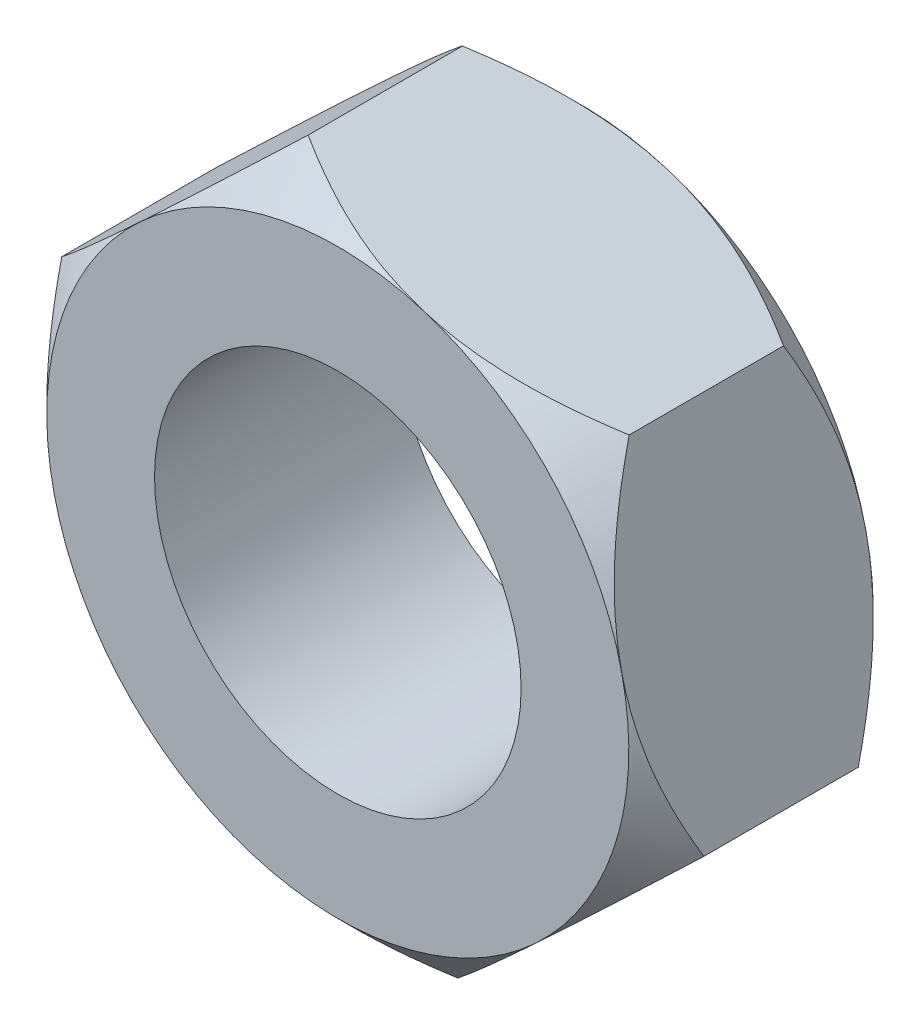
ISO-10303-21;
HEADER;
FILE_DESCRIPTION(('STEP AP214'),'2;1');
FILE_NAME('part.step','',(''),(''),'','','');
FILE_SCHEMA(('AUTOMOTIVE_DESIGN { 1 0 10303 214 1 1 1 1 }'));
ENDSEC;
DATA;
#1=APPLICATION_CONTEXT('core data for automotive mechanical design processes');
#2=APPLICATION_PROTOCOL_DEFINITION('international standard','automotive_design',2000,#1);
#3=PRODUCT_CONTEXT('',#1,'mechanical');
#4=PRODUCT('Part','Part','',(#3));
#5=PRODUCT_RELATED_PRODUCT_CATEGORY('part','',(#4));
#6=PRODUCT_DEFINITION_FORMATION('','',#4);
#7=PRODUCT_DEFINITION_CONTEXT('part definition',#1,'design');
#8=PRODUCT_DEFINITION('design','',#6,#7);
#9=PRODUCT_DEFINITION_SHAPE('','',#8);
#10=(LENGTH_UNIT() NAMED_UNIT(*) SI_UNIT(.MILLI.,.METRE.));
#11=(NAMED_UNIT(*) PLANE_ANGLE_UNIT() SI_UNIT($,.RADIAN.));
#12=(NAMED_UNIT(*) SI_UNIT($,.STERADIAN.) SOLID_ANGLE_UNIT());
#13=UNCERTAINTY_MEASURE_WITH_UNIT(LENGTH_MEASURE(1.E-05),#10,'distance_accuracy_value','');
#14=(GEOMETRIC_REPRESENTATION_CONTEXT(3) GLOBAL_UNCERTAINTY_ASSIGNED_CONTEXT((#13)) GLOBAL_UNIT_ASSIGNED_CONTEXT((#10,
#11,#12)) REPRESENTATION_CONTEXT('',''));
#15=CARTESIAN_POINT('',(0.,0.,0.));
#16=DIRECTION('',(0.,0.,1.));
#17=DIRECTION('',(1.,0.,0.));
#18=AXIS2_PLACEMENT_3D('',#15,#16,#17);
#19=CARTESIAN_POINT('',(0.,0.,-1.));
#20=DIRECTION('',(0.,0.,1.));
#21=DIRECTION('',(1.,0.,0.));
#22=AXIS2_PLACEMENT_3D('',#19,#20,#21);
#23=PLANE('',#22);
#24=CARTESIAN_POINT('',(0.,0.,-1.));
#25=DIRECTION('',(0.,0.,1.));
#26=DIRECTION('',(1.,0.,0.));
#27=AXIS2_PLACEMENT_3D('',#24,#25,#26);
#28=CIRCLE('',#27,1.5);
#29=CARTESIAN_POINT('',(1.5,0.,-1.));
#30=VERTEX_POINT('',#29);
#31=EDGE_CURVE('E291',#30,#30,#28,.F.);
#32=ORIENTED_EDGE('',*,*,#31,.F.);
#33=EDGE_LOOP('',(#32));
#34=FACE_BOUND('',#33,.T.);
#35=CARTESIAN_POINT('',(0.,0.,-1.));
#36=DIRECTION('',(0.,0.,1.));
#37=DIRECTION('',(1.,0.,0.));
#38=AXIS2_PLACEMENT_3D('',#35,#36,#37);
#39=CIRCLE('',#38,2.38156986040721);
#40=CARTESIAN_POINT('',(2.32195813988488,0.52951430256639,-1.));
#41=VERTEX_POINT('',#40);
#42=CARTESIAN_POINT('',(1.61955190763213,-1.74611758438117,-1.));
#43=VERTEX_POINT('',#42);
#44=EDGE_CURVE('E73',#41,#43,#39,.F.);
#45=ORIENTED_EDGE('',*,*,#44,.T.);
#46=CARTESIAN_POINT('',(-0.702406232252746,-2.27563188694756,-1.));
#47=VERTEX_POINT('',#46);
#48=EDGE_CURVE('E13',#43,#47,#39,.F.);
#49=ORIENTED_EDGE('',*,*,#48,.T.);
#50=CARTESIAN_POINT('',(-2.32195813988488,-0.529514302566389,-1.));
#51=VERTEX_POINT('',#50);
#52=EDGE_CURVE('E78',#47,#51,#39,.F.);
#53=ORIENTED_EDGE('',*,*,#52,.T.);
#54=CARTESIAN_POINT('',(-1.61955190763213,1.74611758438117,-1.));
#55=VERTEX_POINT('',#54);
#56=EDGE_CURVE('E400',#51,#55,#39,.F.);
#57=ORIENTED_EDGE('',*,*,#56,.T.);
#58=CARTESIAN_POINT('',(0.702406232252745,2.27563188694756,-1.));
#59=VERTEX_POINT('',#58);
#60=EDGE_CURVE('E176',#55,#59,#39,.F.);
#61=ORIENTED_EDGE('',*,*,#60,.T.);
#62=CARTESIAN_POINT('',(0.,0.,-1.));
#63=DIRECTION('',(0.,0.,1.));
#64=DIRECTION('',(1.,0.,0.));
#65=AXIS2_PLACEMENT_3D('',#62,#63,#64);
#66=CIRCLE('',#65,2.38156986040721);
#67=EDGE_CURVE('E160',#41,#59,#66,.T.);
#68=ORIENTED_EDGE('',*,*,#67,.F.);
#69=EDGE_LOOP('',(#45,#49,#53,#57,#61,#68));
#70=FACE_BOUND('',#69,.T.);
#71=ADVANCED_FACE('F68',(#34,#70),#23,.F.);
#72=CARTESIAN_POINT('',(0.611430450252922,-2.68116631421915,1.));
#73=DIRECTION('',(-0.680035439882169,0.733179241730332,0.));
#74=DIRECTION('',(-0.733179241730332,-0.680035439882169,0.));
#75=AXIS2_PLACEMENT_3D('',#72,#73,#74);
#76=PLANE('',#75);
#77=DIRECTION('',(0.,0.,-1.));
#78=VECTOR('',#77,1.);
#79=CARTESIAN_POINT('',(0.611430450252922,-2.68116631421915,1.));
#80=LINE('',#79,#78);
#81=CARTESIAN_POINT('',(0.611430450252922,-2.68116631421915,0.631569860407208));
#82=VERTEX_POINT('',#81);
#83=CARTESIAN_POINT('',(0.611430450252922,-2.68116631421915,-0.631569860407208));
#84=VERTEX_POINT('',#83);
#85=EDGE_CURVE('E294',#82,#84,#80,.T.);
#86=ORIENTED_EDGE('',*,*,#85,.T.);
#87=CARTESIAN_POINT('',(0.611230450252922,-2.68135181740887,-0.631433457964915));
#88=CARTESIAN_POINT('',(0.680541761179161,-2.6170644711069,-0.678662709142081));
#89=CARTESIAN_POINT('',(0.751012080580562,-2.55170212595966,-0.723118290181747));
#90=CARTESIAN_POINT('',(0.894709000677139,-2.4184209408064,-0.804515707316653));
#91=CARTESIAN_POINT('',(0.967949270087409,-2.35048942284913,-0.841412248853858));
#92=CARTESIAN_POINT('',(1.11563481105216,-2.21350872822774,-0.904616915766419));
#93=CARTESIAN_POINT('',(1.19004246354937,-2.14449444383922,-0.931083918963827));
#94=CARTESIAN_POINT('',(1.34049598707439,-2.00494640124775,-0.971861988156976));
#95=CARTESIAN_POINT('',(1.41653726079552,-1.93441690712008,-0.986203498002277));
#96=CARTESIAN_POINT('',(1.54758795064178,-1.81286530221357,-0.999143140687914));
#97=CARTESIAN_POINT('',(1.60242802258368,-1.76200026086548,-1.00105881335752));
#98=CARTESIAN_POINT('',(1.71201854858218,-1.66035330018718,-0.997832805821307));
#99=CARTESIAN_POINT('',(1.76676896448226,-1.60957141624776,-0.992688651318966));
#100=CARTESIAN_POINT('',(1.8757528517185,-1.50848712269649,-0.97563572227116));
#101=CARTESIAN_POINT('',(1.92998567554035,-1.4581853136645,-0.963719379308982));
#102=CARTESIAN_POINT('',(2.03751351578149,-1.35845152692308,-0.933776198588584));
#103=CARTESIAN_POINT('',(2.09080860375736,-1.30901948284379,-0.915749829218989));
#104=CARTESIAN_POINT('',(2.2273277948899,-1.18239575577936,-0.862231476107135));
#105=CARTESIAN_POINT('',(2.30970521421385,-1.10598938555247,-0.822704331781714));
#106=CARTESIAN_POINT('',(2.43083377411541,-0.993640714413669,-0.755976643536789));
#107=CARTESIAN_POINT('',(2.47075101384226,-0.956616837943207,-0.732531533268135));
#108=CARTESIAN_POINT('',(2.54984601887044,-0.883254959325529,-0.683504038689965));
#109=CARTESIAN_POINT('',(2.58902422045442,-0.846916552519204,-0.657922967018528));
#110=CARTESIAN_POINT('',(2.62787336501134,-0.810883351353467,-0.631433457964914));
#111=B_SPLINE_CURVE_WITH_KNOTS('',3,(#87,#88,#89,#90,#91,#92,#93,#94,#95,#96,#97,#98,#99,#100,
#101,#102,#103,#104,#105,#106,#107,#108,#109,#110),.UNSPECIFIED.,.F.,.F.,(4,2,2,2,2,2,2,2,2,2,2,
4),(0.,0.317249126947665,0.636346964277055,0.950376235600918,1.26361470262345,1.48776348709125,
1.71199085028319,1.93646929815348,2.16093054161688,2.51750160715865,2.69530374505947,
2.87299740912661),.UNSPECIFIED.);
#112=EDGE_CURVE('E87',#84,#43,#111,.T.);
#113=ORIENTED_EDGE('',*,*,#112,.T.);
#114=CARTESIAN_POINT('',(2.62767336501134,-0.811068854543185,-0.631569860407208));
#115=VERTEX_POINT('',#114);
#116=EDGE_CURVE('E174',#43,#115,#111,.T.);
#117=ORIENTED_EDGE('',*,*,#116,.T.);
#118=DIRECTION('',(0.,0.,-1.));
#119=VECTOR('',#118,1.);
#120=CARTESIAN_POINT('',(2.62767336501134,-0.811068854543186,1.));
#121=LINE('',#120,#119);
#122=CARTESIAN_POINT('',(2.62767336501134,-0.811068854543185,0.631569860407208));
#123=VERTEX_POINT('',#122);
#124=EDGE_CURVE('E186',#123,#115,#121,.T.);
#125=ORIENTED_EDGE('',*,*,#124,.F.);
#126=CARTESIAN_POINT('',(0.611230450252922,-2.68135181740887,0.631433457964915));
#127=CARTESIAN_POINT('',(0.680541761179161,-2.6170644711069,0.678662709142081));
#128=CARTESIAN_POINT('',(0.751012080580562,-2.55170212595966,0.723118290181747));
#129=CARTESIAN_POINT('',(0.894709000677139,-2.4184209408064,0.804515707316653));
#130=CARTESIAN_POINT('',(0.967949270087409,-2.35048942284913,0.841412248853858));
#131=CARTESIAN_POINT('',(1.11563481105216,-2.21350872822774,0.904616915766419));
#132=CARTESIAN_POINT('',(1.19004246354937,-2.14449444383922,0.931083918963827));
#133=CARTESIAN_POINT('',(1.34049598707439,-2.00494640124775,0.971861988156976));
#134=CARTESIAN_POINT('',(1.41653726079552,-1.93441690712008,0.986203498002277));
#135=CARTESIAN_POINT('',(1.54758795064178,-1.81286530221357,0.999143140687914));
#136=CARTESIAN_POINT('',(1.60242802258368,-1.76200026086548,1.00105881335752));
#137=CARTESIAN_POINT('',(1.71201854858218,-1.66035330018718,0.997832805821307));
#138=CARTESIAN_POINT('',(1.76676896448226,-1.60957141624776,0.992688651318966));
#139=CARTESIAN_POINT('',(1.8757528517185,-1.50848712269649,0.97563572227116));
#140=CARTESIAN_POINT('',(1.92998567554035,-1.4581853136645,0.963719379308982));
#141=CARTESIAN_POINT('',(2.03751351578149,-1.35845152692308,0.933776198588584));
#142=CARTESIAN_POINT('',(2.09080860375736,-1.30901948284379,0.915749829218989));
#143=CARTESIAN_POINT('',(2.2273277948899,-1.18239575577936,0.862231476107135));
#144=CARTESIAN_POINT('',(2.30970521421385,-1.10598938555247,0.822704331781714));
#145=CARTESIAN_POINT('',(2.43083377411541,-0.993640714413669,0.755976643536789));
#146=CARTESIAN_POINT('',(2.47075101384226,-0.956616837943207,0.732531533268135));
#147=CARTESIAN_POINT('',(2.54984601887044,-0.883254959325529,0.683504038689965));
#148=CARTESIAN_POINT('',(2.58902422045442,-0.846916552519204,0.657922967018528));
#149=CARTESIAN_POINT('',(2.62787336501134,-0.810883351353467,0.631433457964914));
#150=B_SPLINE_CURVE_WITH_KNOTS('',3,(#126,#127,#128,#129,#130,#131,#132,#133,#134,#135,#136,
#137,#138,#139,#140,#141,#142,#143,#144,#145,#146,#147,#148,#149),.UNSPECIFIED.,.F.,.F.,(4,2,2,
2,2,2,2,2,2,2,2,4),(0.,0.317249126947665,0.636346964277055,0.950376235600918,1.26361470262345,
1.48776348709125,1.71199085028319,1.93646929815348,2.16093054161688,2.51750160715865,
2.69530374505947,2.87299740912661),.UNSPECIFIED.);
#151=CARTESIAN_POINT('',(1.61955190763213,-1.74611758438117,1.));
#152=VERTEX_POINT('',#151);
#153=EDGE_CURVE('E281',#152,#123,#150,.T.);
#154=ORIENTED_EDGE('',*,*,#153,.F.);
#155=EDGE_CURVE('E287',#82,#152,#150,.T.);
#156=ORIENTED_EDGE('',*,*,#155,.F.);
#157=EDGE_LOOP('',(#86,#113,#117,#125,#154,#156));
#158=FACE_BOUND('',#157,.T.);
#159=ADVANCED_FACE('F70',(#158),#76,.F.);
#160=CARTESIAN_POINT('',(2.62767336501134,-0.811068854543186,1.));
#161=DIRECTION('',(-0.974969568806964,-0.222338345546518,0.));
#162=DIRECTION('',(0.222338345546518,-0.974969568806964,0.));
#163=AXIS2_PLACEMENT_3D('',#160,#161,#162);
#164=PLANE('',#163);
#165=ORIENTED_EDGE('',*,*,#124,.T.);
#166=CARTESIAN_POINT('',(2.62771897430062,-0.811268854543186,-0.63146728736537));
#167=CARTESIAN_POINT('',(2.60670106162273,-0.719103802174839,-0.678692772648547));
#168=CARTESIAN_POINT('',(2.58533170120751,-0.625397626308076,-0.723144649952084));
#169=CARTESIAN_POINT('',(2.54175722112842,-0.434320410413189,-0.804535001472545));
#170=CARTESIAN_POINT('',(2.51954795737711,-0.336931198264897,-0.841428189989373));
#171=CARTESIAN_POINT('',(2.47476403670943,-0.140550498770503,-0.904626953775373));
#172=CARTESIAN_POINT('',(2.45220078520717,-0.0416090249821052,-0.931091377602507));
#173=CARTESIAN_POINT('',(2.40657755587188,0.158452103129972,-0.971865321713531));
#174=CARTESIAN_POINT('',(2.38351897178063,0.259565645796133,-0.986205278804895));
#175=CARTESIAN_POINT('',(2.34377870848557,0.43382954649138,-0.99914363010685));
#176=CARTESIAN_POINT('',(2.32714836996095,0.506754771965221,-1.00105892206034));
#177=CARTESIAN_POINT('',(2.29391487789397,0.652486014818751,-0.997832196257242));
#178=CARTESIAN_POINT('',(2.27731173592465,0.725291981449826,-0.992687704375998));
#179=CARTESIAN_POINT('',(2.24426222512478,0.870216453270591,-0.975634164767153));
#180=CARTESIAN_POINT('',(2.22781605262658,0.942334097528842,-0.963717549994477));
#181=CARTESIAN_POINT('',(2.19520810198074,1.08532229645022,-0.933773896962632));
#182=CARTESIAN_POINT('',(2.17904630213053,1.15619294628065,-0.91574732714528));
#183=CARTESIAN_POINT('',(2.13764965777203,1.33772019656694,-0.862232375649407));
#184=CARTESIAN_POINT('',(2.11267147344941,1.44725132372695,-0.822710445312067));
#185=CARTESIAN_POINT('',(2.07594322494769,1.6083073238368,-0.755992147989942));
#186=CARTESIAN_POINT('',(2.06383962416678,1.66138248010536,-0.732550429100542));
#187=CARTESIAN_POINT('',(2.03985661651566,1.76654968628756,-0.683530122726857));
#188=CARTESIAN_POINT('',(2.02797707744075,1.81864231592831,-0.657952846939881));
#189=CARTESIAN_POINT('',(2.01619730546913,1.87029745967596,-0.63146728736537));
#190=B_SPLINE_CURVE_WITH_KNOTS('',3,(#166,#167,#168,#169,#170,#171,#172,#173,#174,#175,#176,
#177,#178,#179,#180,#181,#182,#183,#184,#185,#186,#187,#188,#189),.UNSPECIFIED.,.F.,.F.,(4,2,2,
2,2,2,2,2,2,2,2,4),(0.,0.31723309539091,0.636314541517665,0.950328270182844,1.26355135006615,
1.48769951877146,1.7119262610095,1.93640404408789,2.16086462065607,2.51739304394166,
2.6951738520973,2.87284625625676),.UNSPECIFIED.);
#191=EDGE_CURVE('E168',#115,#41,#190,.T.);
#192=ORIENTED_EDGE('',*,*,#191,.T.);
#193=CARTESIAN_POINT('',(2.01624291475841,1.87009745967596,-0.631569860407208));
#194=VERTEX_POINT('',#193);
#195=EDGE_CURVE('E156',#41,#194,#190,.T.);
#196=ORIENTED_EDGE('',*,*,#195,.T.);
#197=DIRECTION('',(0.,0.,-1.));
#198=VECTOR('',#197,1.);
#199=CARTESIAN_POINT('',(2.01624291475841,1.87009745967596,1.));
#200=LINE('',#199,#198);
#201=CARTESIAN_POINT('',(2.01624291475841,1.87009745967596,0.631569860407208));
#202=VERTEX_POINT('',#201);
#203=EDGE_CURVE('E306',#202,#194,#200,.T.);
#204=ORIENTED_EDGE('',*,*,#203,.F.);
#205=CARTESIAN_POINT('',(2.62771897430062,-0.811268854543186,0.63146728736537));
#206=CARTESIAN_POINT('',(2.60670106162273,-0.719103802174839,0.678692772648547));
#207=CARTESIAN_POINT('',(2.58533170120751,-0.625397626308076,0.723144649952084));
#208=CARTESIAN_POINT('',(2.54175722112842,-0.434320410413189,0.804535001472545));
#209=CARTESIAN_POINT('',(2.51954795737711,-0.336931198264897,0.841428189989373));
#210=CARTESIAN_POINT('',(2.47476403670943,-0.140550498770503,0.904626953775373));
#211=CARTESIAN_POINT('',(2.45220078520717,-0.0416090249821052,0.931091377602507));
#212=CARTESIAN_POINT('',(2.40657755587188,0.158452103129972,0.971865321713531));
#213=CARTESIAN_POINT('',(2.38351897178063,0.259565645796133,0.986205278804895));
#214=CARTESIAN_POINT('',(2.34377870848557,0.43382954649138,0.99914363010685));
#215=CARTESIAN_POINT('',(2.32714836996095,0.506754771965221,1.00105892206034));
#216=CARTESIAN_POINT('',(2.29391487789397,0.652486014818751,0.997832196257242));
#217=CARTESIAN_POINT('',(2.27731173592465,0.725291981449826,0.992687704375998));
#218=CARTESIAN_POINT('',(2.24426222512478,0.870216453270591,0.975634164767153));
#219=CARTESIAN_POINT('',(2.22781605262658,0.942334097528842,0.963717549994477));
#220=CARTESIAN_POINT('',(2.19520810198074,1.08532229645022,0.933773896962632));
#221=CARTESIAN_POINT('',(2.17904630213053,1.15619294628065,0.91574732714528));
#222=CARTESIAN_POINT('',(2.13764965777203,1.33772019656694,0.862232375649407));
#223=CARTESIAN_POINT('',(2.11267147344941,1.44725132372695,0.822710445312067));
#224=CARTESIAN_POINT('',(2.07594322494769,1.6083073238368,0.755992147989942));
#225=CARTESIAN_POINT('',(2.06383962416678,1.66138248010536,0.732550429100542));
#226=CARTESIAN_POINT('',(2.03985661651566,1.76654968628756,0.683530122726857));
#227=CARTESIAN_POINT('',(2.02797707744075,1.81864231592831,0.657952846939881));
#228=CARTESIAN_POINT('',(2.01619730546913,1.87029745967596,0.63146728736537));
#229=B_SPLINE_CURVE_WITH_KNOTS('',3,(#205,#206,#207,#208,#209,#210,#211,#212,#213,#214,#215,
#216,#217,#218,#219,#220,#221,#222,#223,#224,#225,#226,#227,#228),.UNSPECIFIED.,.F.,.F.,(4,2,2,
2,2,2,2,2,2,2,2,4),(0.,0.31723309539091,0.636314541517665,0.950328270182844,1.26355135006615,
1.48769951877146,1.7119262610095,1.93640404408789,2.16086462065607,2.51739304394166,
2.6951738520973,2.87284625625676),.UNSPECIFIED.);
#230=CARTESIAN_POINT('',(2.32195813988488,0.52951430256639,1.));
#231=VERTEX_POINT('',#230);
#232=EDGE_CURVE('E274',#231,#202,#229,.T.);
#233=ORIENTED_EDGE('',*,*,#232,.F.);
#234=EDGE_CURVE('E280',#123,#231,#229,.T.);
#235=ORIENTED_EDGE('',*,*,#234,.F.);
#236=EDGE_LOOP('',(#165,#192,#196,#204,#233,#235));
#237=FACE_BOUND('',#236,.T.);
#238=ADVANCED_FACE('F183',(#237),#164,.F.);
#239=CARTESIAN_POINT('',(2.01624291475841,1.87009745967596,1.));
#240=DIRECTION('',(-0.294934128924795,-0.95551758727685,0.));
#241=DIRECTION('',(0.95551758727685,-0.294934128924795,0.));
#242=AXIS2_PLACEMENT_3D('',#239,#240,#241);
#243=PLANE('',#242);
#244=ORIENTED_EDGE('',*,*,#203,.T.);
#245=CARTESIAN_POINT('',(2.01644291475841,1.87003572682398,-0.631465199112025));
#246=CARTESIAN_POINT('',(1.92611644114631,1.89791628095334,-0.678690916856313));
#247=CARTESIAN_POINT('',(1.83427958511017,1.92626303615584,-0.723143022784127));
#248=CARTESIAN_POINT('',(1.64701410418061,1.98406519723698,-0.804533810451347));
#249=CARTESIAN_POINT('',(1.55156766946506,2.0135261003712,-0.84142720594391));
#250=CARTESIAN_POINT('',(1.35910448537038,2.07293260665313,-0.904626334120865));
#251=CARTESIAN_POINT('',(1.26213675241389,2.10286308018302,-0.931090917169493));
#252=CARTESIAN_POINT('',(1.06606654579734,2.16338294540221,-0.97186511591994));
#253=CARTESIAN_POINT('',(0.966970061965575,2.19397048824559,-0.98620516886389));
#254=CARTESIAN_POINT('',(0.796182655111617,2.24668645678715,-0.999143599890724));
#255=CARTESIAN_POINT('',(0.72471237648162,2.26874677744731,-1.00105891535028));
#256=CARTESIAN_POINT('',(0.581888646789228,2.31283135827294,-0.997832233895231));
#257=CARTESIAN_POINT('',(0.510535245462415,2.33485560308681,-0.992687762845372));
#258=CARTESIAN_POINT('',(0.368502186202382,2.37869613220859,-0.975634260936656));
#259=CARTESIAN_POINT('',(0.297823372031236,2.4005121560773,-0.963717662948052));
#260=CARTESIAN_POINT('',(0.15768795159562,2.44376695191573,-0.933774039082376));
#261=CARTESIAN_POINT('',(0.0882312520633301,2.46520575267389,-0.915747481643836));
#262=CARTESIAN_POINT('',(-0.0896751092486592,2.5201190880247,-0.862232320167742));
#263=CARTESIAN_POINT('',(-0.197021726287377,2.55325315212871,-0.822710067969581));
#264=CARTESIAN_POINT('',(-0.354865572177383,2.6019739060045,-0.755991190942998));
#265=CARTESIAN_POINT('',(-0.406882176810341,2.61802957277749,-0.732549262702771));
#266=CARTESIAN_POINT('',(-0.509951879859642,2.64984350639018,-0.683528512598582));
#267=CARTESIAN_POINT('',(-0.561005546463019,2.66560194860891,-0.657951002489993));
#268=CARTESIAN_POINT('',(-0.611630450252923,2.68122804707114,-0.631465199112024));
#269=B_SPLINE_CURVE_WITH_KNOTS('',3,(#245,#246,#247,#248,#249,#250,#251,#252,#253,#254,#255,
#256,#257,#258,#259,#260,#261,#262,#263,#264,#265,#266,#267,#268),.UNSPECIFIED.,.F.,.F.,(4,2,2,
2,2,2,2,2,2,2,2,4),(0.,0.317234084978965,0.63631654289263,0.950331230969133,1.26355526066448,
1.48770346737092,1.71193024793047,1.93640807203655,2.16086868976234,2.51739974543782,
2.69518187031937,2.87285558689427),.UNSPECIFIED.);
#270=EDGE_CURVE('E163',#194,#59,#269,.T.);
#271=ORIENTED_EDGE('',*,*,#270,.T.);
#272=CARTESIAN_POINT('',(-0.611430450252923,2.68116631421915,-0.631569860407208));
#273=VERTEX_POINT('',#272);
#274=EDGE_CURVE('E194',#59,#273,#269,.T.);
#275=ORIENTED_EDGE('',*,*,#274,.T.);
#276=DIRECTION('',(0.,0.,-1.));
#277=VECTOR('',#276,1.);
#278=CARTESIAN_POINT('',(-0.611430450252923,2.68116631421915,1.));
#279=LINE('',#278,#277);
#280=CARTESIAN_POINT('',(-0.611430450252923,2.68116631421915,0.631569860407208));
#281=VERTEX_POINT('',#280);
#282=EDGE_CURVE('E303',#281,#273,#279,.T.);
#283=ORIENTED_EDGE('',*,*,#282,.F.);
#284=CARTESIAN_POINT('',(2.01644291475841,1.87003572682398,0.631465199112025));
#285=CARTESIAN_POINT('',(1.92611644114631,1.89791628095334,0.678690916856313));
#286=CARTESIAN_POINT('',(1.83427958511017,1.92626303615584,0.723143022784127));
#287=CARTESIAN_POINT('',(1.64701410418061,1.98406519723698,0.804533810451347));
#288=CARTESIAN_POINT('',(1.55156766946506,2.0135261003712,0.84142720594391));
#289=CARTESIAN_POINT('',(1.35910448537038,2.07293260665313,0.904626334120865));
#290=CARTESIAN_POINT('',(1.26213675241389,2.10286308018302,0.931090917169493));
#291=CARTESIAN_POINT('',(1.06606654579734,2.16338294540221,0.97186511591994));
#292=CARTESIAN_POINT('',(0.966970061965575,2.19397048824559,0.98620516886389));
#293=CARTESIAN_POINT('',(0.796182655111617,2.24668645678715,0.999143599890724));
#294=CARTESIAN_POINT('',(0.72471237648162,2.26874677744731,1.00105891535028));
#295=CARTESIAN_POINT('',(0.581888646789228,2.31283135827294,0.997832233895231));
#296=CARTESIAN_POINT('',(0.510535245462415,2.33485560308681,0.992687762845372));
#297=CARTESIAN_POINT('',(0.368502186202382,2.37869613220859,0.975634260936656));
#298=CARTESIAN_POINT('',(0.297823372031236,2.4005121560773,0.963717662948052));
#299=CARTESIAN_POINT('',(0.15768795159562,2.44376695191573,0.933774039082376));
#300=CARTESIAN_POINT('',(0.0882312520633301,2.46520575267389,0.915747481643836));
#301=CARTESIAN_POINT('',(-0.0896751092486592,2.5201190880247,0.862232320167742));
#302=CARTESIAN_POINT('',(-0.197021726287377,2.55325315212871,0.822710067969581));
#303=CARTESIAN_POINT('',(-0.354865572177383,2.6019739060045,0.755991190942998));
#304=CARTESIAN_POINT('',(-0.406882176810341,2.61802957277749,0.732549262702771));
#305=CARTESIAN_POINT('',(-0.509951879859642,2.64984350639018,0.683528512598582));
#306=CARTESIAN_POINT('',(-0.561005546463019,2.66560194860891,0.657951002489993));
#307=CARTESIAN_POINT('',(-0.611630450252923,2.68122804707114,0.631465199112024));
#308=B_SPLINE_CURVE_WITH_KNOTS('',3,(#284,#285,#286,#287,#288,#289,#290,#291,#292,#293,#294,
#295,#296,#297,#298,#299,#300,#301,#302,#303,#304,#305,#306,#307),.UNSPECIFIED.,.F.,.F.,(4,2,2,
2,2,2,2,2,2,2,2,4),(0.,0.317234084978965,0.63631654289263,0.950331230969133,1.26355526066448,
1.48770346737092,1.71193024793047,1.93640807203655,2.16086868976234,2.51739974543782,
2.69518187031937,2.87285558689427),.UNSPECIFIED.);
#309=CARTESIAN_POINT('',(0.702406232252745,2.27563188694756,1.));
#310=VERTEX_POINT('',#309);
#311=EDGE_CURVE('E267',#310,#281,#308,.T.);
#312=ORIENTED_EDGE('',*,*,#311,.F.);
#313=EDGE_CURVE('E273',#202,#310,#308,.T.);
#314=ORIENTED_EDGE('',*,*,#313,.F.);
#315=EDGE_LOOP('',(#244,#271,#275,#283,#312,#314));
#316=FACE_BOUND('',#315,.T.);
#317=ADVANCED_FACE('F246',(#316),#243,.F.);
#318=CARTESIAN_POINT('',(-0.611430450252923,2.68116631421915,1.));
#319=DIRECTION('',(0.680035439882169,-0.733179241730332,0.));
#320=DIRECTION('',(0.733179241730332,0.680035439882169,0.));
#321=AXIS2_PLACEMENT_3D('',#318,#319,#320);
#322=PLANE('',#321);
#323=ORIENTED_EDGE('',*,*,#282,.T.);
#324=CARTESIAN_POINT('',(-0.611230450252923,2.68135181740887,-0.631433457964914));
#325=CARTESIAN_POINT('',(-0.680541761179161,2.6170644711069,-0.678662709142081));
#326=CARTESIAN_POINT('',(-0.751012080580562,2.55170212595966,-0.723118290181747));
#327=CARTESIAN_POINT('',(-0.89470900067714,2.4184209408064,-0.804515707316653));
#328=CARTESIAN_POINT('',(-0.967949270087409,2.35048942284913,-0.841412248853858));
#329=CARTESIAN_POINT('',(-1.11563481105216,2.21350872822774,-0.904616915766419));
#330=CARTESIAN_POINT('',(-1.19004246354937,2.14449444383922,-0.931083918963826));
#331=CARTESIAN_POINT('',(-1.3404959870744,2.00494640124775,-0.971861988156975));
#332=CARTESIAN_POINT('',(-1.41653726079553,1.93441690712008,-0.986203498002276));
#333=CARTESIAN_POINT('',(-1.54758795064178,1.81286530221357,-0.999143140687913));
#334=CARTESIAN_POINT('',(-1.60242802258368,1.76200026086548,-1.00105881335752));
#335=CARTESIAN_POINT('',(-1.71201854858218,1.66035330018718,-0.997832805821307));
#336=CARTESIAN_POINT('',(-1.76676896448226,1.60957141624776,-0.992688651318966));
#337=CARTESIAN_POINT('',(-1.8757528517185,1.50848712269649,-0.97563572227116));
#338=CARTESIAN_POINT('',(-1.92998567554035,1.4581853136645,-0.963719379308982));
#339=CARTESIAN_POINT('',(-2.03751351578149,1.35845152692308,-0.933776198588584));
#340=CARTESIAN_POINT('',(-2.09080860375736,1.30901948284379,-0.915749829218989));
#341=CARTESIAN_POINT('',(-2.2273277948899,1.18239575577936,-0.862231476107135));
#342=CARTESIAN_POINT('',(-2.30970521421385,1.10598938555247,-0.822704331781714));
#343=CARTESIAN_POINT('',(-2.43083377411541,0.99364071441367,-0.755976643536789));
#344=CARTESIAN_POINT('',(-2.47075101384226,0.956616837943208,-0.732531533268135));
#345=CARTESIAN_POINT('',(-2.54984601887044,0.88325495932553,-0.683504038689965));
#346=CARTESIAN_POINT('',(-2.58902422045442,0.846916552519206,-0.657922967018528));
#347=CARTESIAN_POINT('',(-2.62787336501134,0.810883351353468,-0.631433457964914));
#348=B_SPLINE_CURVE_WITH_KNOTS('',3,(#324,#325,#326,#327,#328,#329,#330,#331,#332,#333,#334,
#335,#336,#337,#338,#339,#340,#341,#342,#343,#344,#345,#346,#347),.UNSPECIFIED.,.F.,.F.,(4,2,2,
2,2,2,2,2,2,2,2,4),(0.,0.317249126947665,0.636346964277055,0.950376235600918,1.26361470262345,
1.48776348709125,1.71199085028319,1.93646929815348,2.16093054161688,2.51750160715865,
2.69530374505947,2.87299740912661),.UNSPECIFIED.);
#349=EDGE_CURVE('E240',#273,#55,#348,.T.);
#350=ORIENTED_EDGE('',*,*,#349,.T.);
#351=CARTESIAN_POINT('',(-2.62767336501134,0.811068854543187,-0.631569860407208));
#352=VERTEX_POINT('',#351);
#353=EDGE_CURVE('E233',#55,#352,#348,.T.);
#354=ORIENTED_EDGE('',*,*,#353,.T.);
#355=DIRECTION('',(0.,0.,-1.));
#356=VECTOR('',#355,1.);
#357=CARTESIAN_POINT('',(-2.62767336501134,0.811068854543187,1.));
#358=LINE('',#357,#356);
#359=CARTESIAN_POINT('',(-2.62767336501134,0.811068854543187,0.631569860407208));
#360=VERTEX_POINT('',#359);
#361=EDGE_CURVE('E300',#360,#352,#358,.T.);
#362=ORIENTED_EDGE('',*,*,#361,.F.);
#363=CARTESIAN_POINT('',(-0.611230450252923,2.68135181740887,0.631433457964914));
#364=CARTESIAN_POINT('',(-0.680541761179161,2.6170644711069,0.678662709142081));
#365=CARTESIAN_POINT('',(-0.751012080580562,2.55170212595966,0.723118290181747));
#366=CARTESIAN_POINT('',(-0.89470900067714,2.4184209408064,0.804515707316653));
#367=CARTESIAN_POINT('',(-0.967949270087409,2.35048942284913,0.841412248853858));
#368=CARTESIAN_POINT('',(-1.11563481105216,2.21350872822774,0.904616915766419));
#369=CARTESIAN_POINT('',(-1.19004246354937,2.14449444383922,0.931083918963826));
#370=CARTESIAN_POINT('',(-1.3404959870744,2.00494640124775,0.971861988156975));
#371=CARTESIAN_POINT('',(-1.41653726079553,1.93441690712008,0.986203498002276));
#372=CARTESIAN_POINT('',(-1.54758795064178,1.81286530221357,0.999143140687913));
#373=CARTESIAN_POINT('',(-1.60242802258368,1.76200026086548,1.00105881335752));
#374=CARTESIAN_POINT('',(-1.71201854858218,1.66035330018718,0.997832805821307));
#375=CARTESIAN_POINT('',(-1.76676896448226,1.60957141624776,0.992688651318966));
#376=CARTESIAN_POINT('',(-1.8757528517185,1.50848712269649,0.97563572227116));
#377=CARTESIAN_POINT('',(-1.92998567554035,1.4581853136645,0.963719379308982));
#378=CARTESIAN_POINT('',(-2.03751351578149,1.35845152692308,0.933776198588584));
#379=CARTESIAN_POINT('',(-2.09080860375736,1.30901948284379,0.915749829218989));
#380=CARTESIAN_POINT('',(-2.2273277948899,1.18239575577936,0.862231476107135));
#381=CARTESIAN_POINT('',(-2.30970521421385,1.10598938555247,0.822704331781714));
#382=CARTESIAN_POINT('',(-2.43083377411541,0.99364071441367,0.755976643536789));
#383=CARTESIAN_POINT('',(-2.47075101384226,0.956616837943208,0.732531533268135));
#384=CARTESIAN_POINT('',(-2.54984601887044,0.88325495932553,0.683504038689965));
#385=CARTESIAN_POINT('',(-2.58902422045442,0.846916552519206,0.657922967018528));
#386=CARTESIAN_POINT('',(-2.62787336501134,0.810883351353468,0.631433457964914));
#387=B_SPLINE_CURVE_WITH_KNOTS('',3,(#363,#364,#365,#366,#367,#368,#369,#370,#371,#372,#373,
#374,#375,#376,#377,#378,#379,#380,#381,#382,#383,#384,#385,#386),.UNSPECIFIED.,.F.,.F.,(4,2,2,
2,2,2,2,2,2,2,2,4),(0.,0.317249126947665,0.636346964277055,0.950376235600918,1.26361470262345,
1.48776348709125,1.71199085028319,1.93646929815348,2.16093054161688,2.51750160715865,
2.69530374505947,2.87299740912661),.UNSPECIFIED.);
#388=CARTESIAN_POINT('',(-1.61955190763213,1.74611758438117,1.));
#389=VERTEX_POINT('',#388);
#390=EDGE_CURVE('E252',#389,#360,#387,.T.);
#391=ORIENTED_EDGE('',*,*,#390,.F.);
#392=EDGE_CURVE('E259',#281,#389,#387,.T.);
#393=ORIENTED_EDGE('',*,*,#392,.F.);
#394=EDGE_LOOP('',(#323,#350,#354,#362,#391,#393));
#395=FACE_BOUND('',#394,.T.);
#396=ADVANCED_FACE('F242',(#395),#322,.F.);
#397=CARTESIAN_POINT('',(-2.62767336501134,0.811068854543187,1.));
#398=DIRECTION('',(0.974969568806964,0.222338345546517,0.));
#399=DIRECTION('',(-0.222338345546517,0.974969568806964,0.));
#400=AXIS2_PLACEMENT_3D('',#397,#398,#399);
#401=PLANE('',#400);
#402=ORIENTED_EDGE('',*,*,#361,.T.);
#403=CARTESIAN_POINT('',(-2.62771897430062,0.811268854543187,-0.63146728736537));
#404=CARTESIAN_POINT('',(-2.60670106162273,0.71910380217484,-0.678692772648547));
#405=CARTESIAN_POINT('',(-2.58533170120751,0.625397626308077,-0.723144649952084));
#406=CARTESIAN_POINT('',(-2.54175722112842,0.43432041041319,-0.804535001472545));
#407=CARTESIAN_POINT('',(-2.51954795737711,0.336931198264899,-0.841428189989372));
#408=CARTESIAN_POINT('',(-2.47476403670943,0.140550498770504,-0.904626953775373));
#409=CARTESIAN_POINT('',(-2.45220078520717,0.0416090249821068,-0.931091377602507));
#410=CARTESIAN_POINT('',(-2.40657755587188,-0.158452103129971,-0.97186532171353));
#411=CARTESIAN_POINT('',(-2.38351897178063,-0.259565645796132,-0.986205278804895));
#412=CARTESIAN_POINT('',(-2.34377870848557,-0.433829546491378,-0.99914363010685));
#413=CARTESIAN_POINT('',(-2.32714836996095,-0.50675477196522,-1.00105892206034));
#414=CARTESIAN_POINT('',(-2.29391487789397,-0.65248601481875,-0.997832196257242));
#415=CARTESIAN_POINT('',(-2.27731173592465,-0.725291981449825,-0.992687704375998));
#416=CARTESIAN_POINT('',(-2.24426222512478,-0.87021645327059,-0.975634164767153));
#417=CARTESIAN_POINT('',(-2.22781605262658,-0.942334097528841,-0.963717549994478));
#418=CARTESIAN_POINT('',(-2.19520810198074,-1.08532229645022,-0.933773896962632));
#419=CARTESIAN_POINT('',(-2.17904630213053,-1.15619294628065,-0.91574732714528));
#420=CARTESIAN_POINT('',(-2.13764965777203,-1.33772019656694,-0.862232375649406));
#421=CARTESIAN_POINT('',(-2.11267147344941,-1.44725132372695,-0.822710445312067));
#422=CARTESIAN_POINT('',(-2.07594322494769,-1.6083073238368,-0.755992147989942));
#423=CARTESIAN_POINT('',(-2.06383962416678,-1.66138248010536,-0.732550429100542));
#424=CARTESIAN_POINT('',(-2.03985661651567,-1.76654968628756,-0.683530122726856));
#425=CARTESIAN_POINT('',(-2.02797707744075,-1.81864231592831,-0.657952846939881));
#426=CARTESIAN_POINT('',(-2.01619730546913,-1.87029745967596,-0.63146728736537));
#427=B_SPLINE_CURVE_WITH_KNOTS('',3,(#403,#404,#405,#406,#407,#408,#409,#410,#411,#412,#413,
#414,#415,#416,#417,#418,#419,#420,#421,#422,#423,#424,#425,#426),.UNSPECIFIED.,.F.,.F.,(4,2,2,
2,2,2,2,2,2,2,2,4),(0.,0.31723309539091,0.636314541517665,0.950328270182843,1.26355135006615,
1.48769951877146,1.7119262610095,1.93640404408789,2.16086462065607,2.51739304394166,
2.6951738520973,2.87284625625676),.UNSPECIFIED.);
#428=EDGE_CURVE('E241',#352,#51,#427,.T.);
#429=ORIENTED_EDGE('',*,*,#428,.T.);
#430=CARTESIAN_POINT('',(-2.01624291475841,-1.87009745967596,-0.631569860407208));
#431=VERTEX_POINT('',#430);
#432=EDGE_CURVE('E226',#51,#431,#427,.T.);
#433=ORIENTED_EDGE('',*,*,#432,.T.);
#434=DIRECTION('',(0.,0.,-1.));
#435=VECTOR('',#434,1.);
#436=CARTESIAN_POINT('',(-2.01624291475841,-1.87009745967596,1.));
#437=LINE('',#436,#435);
#438=CARTESIAN_POINT('',(-2.01624291475841,-1.87009745967596,0.631569860407208));
#439=VERTEX_POINT('',#438);
#440=EDGE_CURVE('E297',#439,#431,#437,.T.);
#441=ORIENTED_EDGE('',*,*,#440,.F.);
#442=CARTESIAN_POINT('',(-2.62771897430062,0.811268854543187,0.63146728736537));
#443=CARTESIAN_POINT('',(-2.60670106162273,0.71910380217484,0.678692772648547));
#444=CARTESIAN_POINT('',(-2.58533170120751,0.625397626308077,0.723144649952084));
#445=CARTESIAN_POINT('',(-2.54175722112842,0.43432041041319,0.804535001472545));
#446=CARTESIAN_POINT('',(-2.51954795737711,0.336931198264899,0.841428189989372));
#447=CARTESIAN_POINT('',(-2.47476403670943,0.140550498770504,0.904626953775373));
#448=CARTESIAN_POINT('',(-2.45220078520717,0.0416090249821068,0.931091377602507));
#449=CARTESIAN_POINT('',(-2.40657755587188,-0.158452103129971,0.97186532171353));
#450=CARTESIAN_POINT('',(-2.38351897178063,-0.259565645796132,0.986205278804895));
#451=CARTESIAN_POINT('',(-2.34377870848557,-0.433829546491378,0.99914363010685));
#452=CARTESIAN_POINT('',(-2.32714836996095,-0.50675477196522,1.00105892206034));
#453=CARTESIAN_POINT('',(-2.29391487789397,-0.65248601481875,0.997832196257242));
#454=CARTESIAN_POINT('',(-2.27731173592465,-0.725291981449825,0.992687704375998));
#455=CARTESIAN_POINT('',(-2.24426222512478,-0.87021645327059,0.975634164767153));
#456=CARTESIAN_POINT('',(-2.22781605262658,-0.942334097528841,0.963717549994478));
#457=CARTESIAN_POINT('',(-2.19520810198074,-1.08532229645022,0.933773896962632));
#458=CARTESIAN_POINT('',(-2.17904630213053,-1.15619294628065,0.91574732714528));
#459=CARTESIAN_POINT('',(-2.13764965777203,-1.33772019656694,0.862232375649406));
#460=CARTESIAN_POINT('',(-2.11267147344941,-1.44725132372695,0.822710445312067));
#461=CARTESIAN_POINT('',(-2.07594322494769,-1.6083073238368,0.755992147989942));
#462=CARTESIAN_POINT('',(-2.06383962416678,-1.66138248010536,0.732550429100542));
#463=CARTESIAN_POINT('',(-2.03985661651567,-1.76654968628756,0.683530122726856));
#464=CARTESIAN_POINT('',(-2.02797707744075,-1.81864231592831,0.657952846939881));
#465=CARTESIAN_POINT('',(-2.01619730546913,-1.87029745967596,0.63146728736537));
#466=B_SPLINE_CURVE_WITH_KNOTS('',3,(#442,#443,#444,#445,#446,#447,#448,#449,#450,#451,#452,
#453,#454,#455,#456,#457,#458,#459,#460,#461,#462,#463,#464,#465),.UNSPECIFIED.,.F.,.F.,(4,2,2,
2,2,2,2,2,2,2,2,4),(0.,0.31723309539091,0.636314541517665,0.950328270182843,1.26355135006615,
1.48769951877146,1.7119262610095,1.93640404408789,2.16086462065607,2.51739304394166,
2.6951738520973,2.87284625625676),.UNSPECIFIED.);
#467=CARTESIAN_POINT('',(-2.32195813988488,-0.529514302566389,1.));
#468=VERTEX_POINT('',#467);
#469=EDGE_CURVE('E261',#468,#439,#466,.T.);
#470=ORIENTED_EDGE('',*,*,#469,.F.);
#471=EDGE_CURVE('E260',#360,#468,#466,.T.);
#472=ORIENTED_EDGE('',*,*,#471,.F.);
#473=EDGE_LOOP('',(#402,#429,#433,#441,#470,#472));
#474=FACE_BOUND('',#473,.T.);
#475=ADVANCED_FACE('F245',(#474),#401,.F.);
#476=CARTESIAN_POINT('',(-2.01624291475841,-1.87009745967596,1.));
#477=DIRECTION('',(0.294934128924795,0.95551758727685,0.));
#478=DIRECTION('',(-0.95551758727685,0.294934128924795,0.));
#479=AXIS2_PLACEMENT_3D('',#476,#477,#478);
#480=PLANE('',#479);
#481=ORIENTED_EDGE('',*,*,#440,.T.);
#482=CARTESIAN_POINT('',(-2.01644291475841,-1.87003572682398,-0.631465199112024));
#483=CARTESIAN_POINT('',(-1.92611644114631,-1.89791628095334,-0.678690916856313));
#484=CARTESIAN_POINT('',(-1.83427958511017,-1.92626303615584,-0.723143022784127));
#485=CARTESIAN_POINT('',(-1.64701410418061,-1.98406519723698,-0.804533810451347));
#486=CARTESIAN_POINT('',(-1.55156766946506,-2.0135261003712,-0.84142720594391));
#487=CARTESIAN_POINT('',(-1.35910448537038,-2.07293260665313,-0.904626334120865));
#488=CARTESIAN_POINT('',(-1.26213675241389,-2.10286308018302,-0.931090917169493));
#489=CARTESIAN_POINT('',(-1.06606654579734,-2.16338294540221,-0.97186511591994));
#490=CARTESIAN_POINT('',(-0.966970061965575,-2.19397048824559,-0.98620516886389));
#491=CARTESIAN_POINT('',(-0.796182655111617,-2.24668645678715,-0.999143599890724));
#492=CARTESIAN_POINT('',(-0.72471237648162,-2.26874677744731,-1.00105891535028));
#493=CARTESIAN_POINT('',(-0.581888646789228,-2.31283135827294,-0.997832233895231));
#494=CARTESIAN_POINT('',(-0.510535245462415,-2.33485560308681,-0.992687762845372));
#495=CARTESIAN_POINT('',(-0.368502186202381,-2.37869613220859,-0.975634260936656));
#496=CARTESIAN_POINT('',(-0.297823372031236,-2.4005121560773,-0.963717662948052));
#497=CARTESIAN_POINT('',(-0.15768795159562,-2.44376695191573,-0.933774039082375));
#498=CARTESIAN_POINT('',(-0.0882312520633295,-2.46520575267389,-0.915747481643835));
#499=CARTESIAN_POINT('',(0.0896751092486597,-2.5201190880247,-0.862232320167742));
#500=CARTESIAN_POINT('',(0.197021726287377,-2.55325315212871,-0.82271006796958));
#501=CARTESIAN_POINT('',(0.354865572177383,-2.6019739060045,-0.755991190942998));
#502=CARTESIAN_POINT('',(0.406882176810341,-2.61802957277749,-0.732549262702771));
#503=CARTESIAN_POINT('',(0.509951879859642,-2.64984350639018,-0.683528512598582));
#504=CARTESIAN_POINT('',(0.561005546463018,-2.66560194860891,-0.657951002489993));
#505=CARTESIAN_POINT('',(0.611630450252923,-2.68122804707114,-0.631465199112024));
#506=B_SPLINE_CURVE_WITH_KNOTS('',3,(#482,#483,#484,#485,#486,#487,#488,#489,#490,#491,#492,
#493,#494,#495,#496,#497,#498,#499,#500,#501,#502,#503,#504,#505),.UNSPECIFIED.,.F.,.F.,(4,2,2,
2,2,2,2,2,2,2,2,4),(0.,0.317234084978965,0.636316542892631,0.950331230969134,1.26355526066448,
1.48770346737092,1.71193024793047,1.93640807203656,2.16086868976235,2.51739974543782,
2.69518187031937,2.87285558689427),.UNSPECIFIED.);
#507=EDGE_CURVE('E394',#431,#47,#506,.T.);
#508=ORIENTED_EDGE('',*,*,#507,.T.);
#509=EDGE_CURVE('E180',#47,#84,#506,.T.);
#510=ORIENTED_EDGE('',*,*,#509,.T.);
#511=ORIENTED_EDGE('',*,*,#85,.F.);
#512=CARTESIAN_POINT('',(-2.01644291475841,-1.87003572682398,0.631465199112024));
#513=CARTESIAN_POINT('',(-1.92611644114631,-1.89791628095334,0.678690916856313));
#514=CARTESIAN_POINT('',(-1.83427958511017,-1.92626303615584,0.723143022784127));
#515=CARTESIAN_POINT('',(-1.64701410418061,-1.98406519723698,0.804533810451347));
#516=CARTESIAN_POINT('',(-1.55156766946506,-2.0135261003712,0.84142720594391));
#517=CARTESIAN_POINT('',(-1.35910448537038,-2.07293260665313,0.904626334120865));
#518=CARTESIAN_POINT('',(-1.26213675241389,-2.10286308018302,0.931090917169493));
#519=CARTESIAN_POINT('',(-1.06606654579734,-2.16338294540221,0.97186511591994));
#520=CARTESIAN_POINT('',(-0.966970061965575,-2.19397048824559,0.98620516886389));
#521=CARTESIAN_POINT('',(-0.796182655111617,-2.24668645678715,0.999143599890724));
#522=CARTESIAN_POINT('',(-0.72471237648162,-2.26874677744731,1.00105891535028));
#523=CARTESIAN_POINT('',(-0.581888646789228,-2.31283135827294,0.997832233895231));
#524=CARTESIAN_POINT('',(-0.510535245462415,-2.33485560308681,0.992687762845372));
#525=CARTESIAN_POINT('',(-0.368502186202381,-2.37869613220859,0.975634260936656));
#526=CARTESIAN_POINT('',(-0.297823372031236,-2.4005121560773,0.963717662948052));
#527=CARTESIAN_POINT('',(-0.15768795159562,-2.44376695191573,0.933774039082375));
#528=CARTESIAN_POINT('',(-0.0882312520633295,-2.46520575267389,0.915747481643835));
#529=CARTESIAN_POINT('',(0.0896751092486597,-2.5201190880247,0.862232320167742));
#530=CARTESIAN_POINT('',(0.197021726287377,-2.55325315212871,0.82271006796958));
#531=CARTESIAN_POINT('',(0.354865572177383,-2.6019739060045,0.755991190942998));
#532=CARTESIAN_POINT('',(0.406882176810341,-2.61802957277749,0.732549262702771));
#533=CARTESIAN_POINT('',(0.509951879859642,-2.64984350639018,0.683528512598582));
#534=CARTESIAN_POINT('',(0.561005546463018,-2.66560194860891,0.657951002489993));
#535=CARTESIAN_POINT('',(0.611630450252923,-2.68122804707114,0.631465199112024));
#536=B_SPLINE_CURVE_WITH_KNOTS('',3,(#512,#513,#514,#515,#516,#517,#518,#519,#520,#521,#522,
#523,#524,#525,#526,#527,#528,#529,#530,#531,#532,#533,#534,#535),.UNSPECIFIED.,.F.,.F.,(4,2,2,
2,2,2,2,2,2,2,2,4),(0.,0.317234084978965,0.636316542892631,0.950331230969134,1.26355526066448,
1.48770346737092,1.71193024793047,1.93640807203656,2.16086868976235,2.51739974543782,
2.69518187031937,2.87285558689427),.UNSPECIFIED.);
#537=CARTESIAN_POINT('',(-0.702406232252746,-2.27563188694756,1.));
#538=VERTEX_POINT('',#537);
#539=EDGE_CURVE('E332',#538,#82,#536,.T.);
#540=ORIENTED_EDGE('',*,*,#539,.F.);
#541=EDGE_CURVE('E335',#439,#538,#536,.T.);
#542=ORIENTED_EDGE('',*,*,#541,.F.);
#543=EDGE_LOOP('',(#481,#508,#510,#511,#540,#542));
#544=FACE_BOUND('',#543,.T.);
#545=ADVANCED_FACE('F340',(#544),#480,.F.);
#546=CARTESIAN_POINT('',(0.,0.,1.));
#547=DIRECTION('',(0.,0.,1.));
#548=DIRECTION('',(1.,0.,0.));
#549=AXIS2_PLACEMENT_3D('',#546,#547,#548);
#550=PLANE('',#549);
#551=CARTESIAN_POINT('',(0.,0.,1.));
#552=DIRECTION('',(0.,0.,1.));
#553=DIRECTION('',(1.,0.,0.));
#554=AXIS2_PLACEMENT_3D('',#551,#552,#553);
#555=CIRCLE('',#554,1.5);
#556=CARTESIAN_POINT('',(1.5,0.,1.));
#557=VERTEX_POINT('',#556);
#558=EDGE_CURVE('E288',#557,#557,#555,.T.);
#559=ORIENTED_EDGE('',*,*,#558,.F.);
#560=EDGE_LOOP('',(#559));
#561=FACE_BOUND('',#560,.T.);
#562=CARTESIAN_POINT('',(0.,0.,1.));
#563=DIRECTION('',(0.,0.,1.));
#564=DIRECTION('',(1.,0.,0.));
#565=AXIS2_PLACEMENT_3D('',#562,#563,#564);
#566=CIRCLE('',#565,2.38156986040721);
#567=EDGE_CURVE('E308',#152,#231,#566,.T.);
#568=ORIENTED_EDGE('',*,*,#567,.T.);
#569=CARTESIAN_POINT('',(0.,0.,1.));
#570=DIRECTION('',(0.,0.,1.));
#571=DIRECTION('',(1.,0.,0.));
#572=AXIS2_PLACEMENT_3D('',#569,#570,#571);
#573=CIRCLE('',#572,2.38156986040721);
#574=EDGE_CURVE('E341',#231,#310,#573,.T.);
#575=ORIENTED_EDGE('',*,*,#574,.T.);
#576=EDGE_CURVE('E177',#310,#389,#566,.T.);
#577=ORIENTED_EDGE('',*,*,#576,.T.);
#578=EDGE_CURVE('E318',#389,#468,#566,.T.);
#579=ORIENTED_EDGE('',*,*,#578,.T.);
#580=EDGE_CURVE('E316',#468,#538,#566,.T.);
#581=ORIENTED_EDGE('',*,*,#580,.T.);
#582=EDGE_CURVE('E310',#538,#152,#566,.T.);
#583=ORIENTED_EDGE('',*,*,#582,.T.);
#584=EDGE_LOOP('',(#568,#575,#577,#579,#581,#583));
#585=FACE_BOUND('',#584,.T.);
#586=ADVANCED_FACE('F326',(#561,#585),#550,.T.);
#587=CARTESIAN_POINT('',(0.,0.,-1.001));
#588=DIRECTION('',(0.,0.,1.));
#589=DIRECTION('',(1.,0.,0.));
#590=AXIS2_PLACEMENT_3D('',#587,#588,#589);
#591=CYLINDRICAL_SURFACE('',#590,1.5);
#592=ORIENTED_EDGE('',*,*,#558,.T.);
#593=EDGE_LOOP('',(#592));
#594=FACE_BOUND('',#593,.T.);
#595=ORIENTED_EDGE('',*,*,#31,.T.);
#596=EDGE_LOOP('',(#595));
#597=FACE_BOUND('',#596,.T.);
#598=ADVANCED_FACE('F352',(#594,#597),#591,.F.);
#599=CARTESIAN_POINT('',(0.,0.,1.));
#600=DIRECTION('',(0.,0.,-1.));
#601=DIRECTION('',(1.,0.,0.));
#602=AXIS2_PLACEMENT_3D('',#599,#600,#601);
#603=CONICAL_SURFACE('',#602,2.38156986040721,0.78539816339745);
#604=ORIENTED_EDGE('',*,*,#153,.T.);
#605=ORIENTED_EDGE('',*,*,#234,.T.);
#606=ORIENTED_EDGE('',*,*,#567,.F.);
#607=EDGE_LOOP('',(#604,#605,#606));
#608=FACE_BOUND('',#607,.T.);
#609=ADVANCED_FACE('F357',(#608),#603,.T.);
#610=ORIENTED_EDGE('',*,*,#155,.T.);
#611=ORIENTED_EDGE('',*,*,#582,.F.);
#612=ORIENTED_EDGE('',*,*,#539,.T.);
#613=EDGE_LOOP('',(#610,#611,#612));
#614=FACE_BOUND('',#613,.T.);
#615=ADVANCED_FACE('F212',(#614),#603,.T.);
#616=ORIENTED_EDGE('',*,*,#469,.T.);
#617=ORIENTED_EDGE('',*,*,#541,.T.);
#618=ORIENTED_EDGE('',*,*,#580,.F.);
#619=EDGE_LOOP('',(#616,#617,#618));
#620=FACE_BOUND('',#619,.T.);
#621=ADVANCED_FACE('F336',(#620),#603,.T.);
#622=ORIENTED_EDGE('',*,*,#390,.T.);
#623=ORIENTED_EDGE('',*,*,#471,.T.);
#624=ORIENTED_EDGE('',*,*,#578,.F.);
#625=EDGE_LOOP('',(#622,#623,#624));
#626=FACE_BOUND('',#625,.T.);
#627=ADVANCED_FACE('F377',(#626),#603,.T.);
#628=ORIENTED_EDGE('',*,*,#311,.T.);
#629=ORIENTED_EDGE('',*,*,#392,.T.);
#630=ORIENTED_EDGE('',*,*,#576,.F.);
#631=EDGE_LOOP('',(#628,#629,#630));
#632=FACE_BOUND('',#631,.T.);
#633=ADVANCED_FACE('F371',(#632),#603,.T.);
#634=ORIENTED_EDGE('',*,*,#232,.T.);
#635=ORIENTED_EDGE('',*,*,#313,.T.);
#636=ORIENTED_EDGE('',*,*,#574,.F.);
#637=EDGE_LOOP('',(#634,#635,#636));
#638=FACE_BOUND('',#637,.T.);
#639=ADVANCED_FACE('F363',(#638),#603,.T.);
#640=CARTESIAN_POINT('',(0.,0.,-1.));
#641=DIRECTION('',(0.,0.,1.));
#642=DIRECTION('',(1.,0.,0.));
#643=AXIS2_PLACEMENT_3D('',#640,#641,#642);
#644=CONICAL_SURFACE('',#643,2.38156986040721,0.78539816339745);
#645=ORIENTED_EDGE('',*,*,#44,.F.);
#646=ORIENTED_EDGE('',*,*,#191,.F.);
#647=ORIENTED_EDGE('',*,*,#116,.F.);
#648=EDGE_LOOP('',(#645,#646,#647));
#649=FACE_BOUND('',#648,.T.);
#650=ADVANCED_FACE('F172',(#649),#644,.T.);
#651=ORIENTED_EDGE('',*,*,#67,.T.);
#652=ORIENTED_EDGE('',*,*,#270,.F.);
#653=ORIENTED_EDGE('',*,*,#195,.F.);
#654=EDGE_LOOP('',(#651,#652,#653));
#655=FACE_BOUND('',#654,.T.);
#656=ADVANCED_FACE('F158',(#655),#644,.T.);
#657=ORIENTED_EDGE('',*,*,#60,.F.);
#658=ORIENTED_EDGE('',*,*,#349,.F.);
#659=ORIENTED_EDGE('',*,*,#274,.F.);
#660=EDGE_LOOP('',(#657,#658,#659));
#661=FACE_BOUND('',#660,.T.);
#662=ADVANCED_FACE('F403',(#661),#644,.T.);
#663=ORIENTED_EDGE('',*,*,#56,.F.);
#664=ORIENTED_EDGE('',*,*,#428,.F.);
#665=ORIENTED_EDGE('',*,*,#353,.F.);
#666=EDGE_LOOP('',(#663,#664,#665));
#667=FACE_BOUND('',#666,.T.);
#668=ADVANCED_FACE('F399',(#667),#644,.T.);
#669=ORIENTED_EDGE('',*,*,#52,.F.);
#670=ORIENTED_EDGE('',*,*,#507,.F.);
#671=ORIENTED_EDGE('',*,*,#432,.F.);
#672=EDGE_LOOP('',(#669,#670,#671));
#673=FACE_BOUND('',#672,.T.);
#674=ADVANCED_FACE('F211',(#673),#644,.T.);
#675=ORIENTED_EDGE('',*,*,#509,.F.);
#676=ORIENTED_EDGE('',*,*,#48,.F.);
#677=ORIENTED_EDGE('',*,*,#112,.F.);
#678=EDGE_LOOP('',(#675,#676,#677));
#679=FACE_BOUND('',#678,.T.);
#680=ADVANCED_FACE('F207',(#679),#644,.T.);
#681=CLOSED_SHELL('',(#71,#159,#238,#317,#396,#475,#545,#586,#598,#609,#615,#621,#627,#633,#639,
#650,#656,#662,#668,#674,#680));
#682=MANIFOLD_SOLID_BREP('B2',#681);
#683=ADVANCED_BREP_SHAPE_REPRESENTATION('',(#18,#682),#14);
#684=SHAPE_DEFINITION_REPRESENTATION(#9,#683);
ENDSEC;
END-ISO-10303-21;
